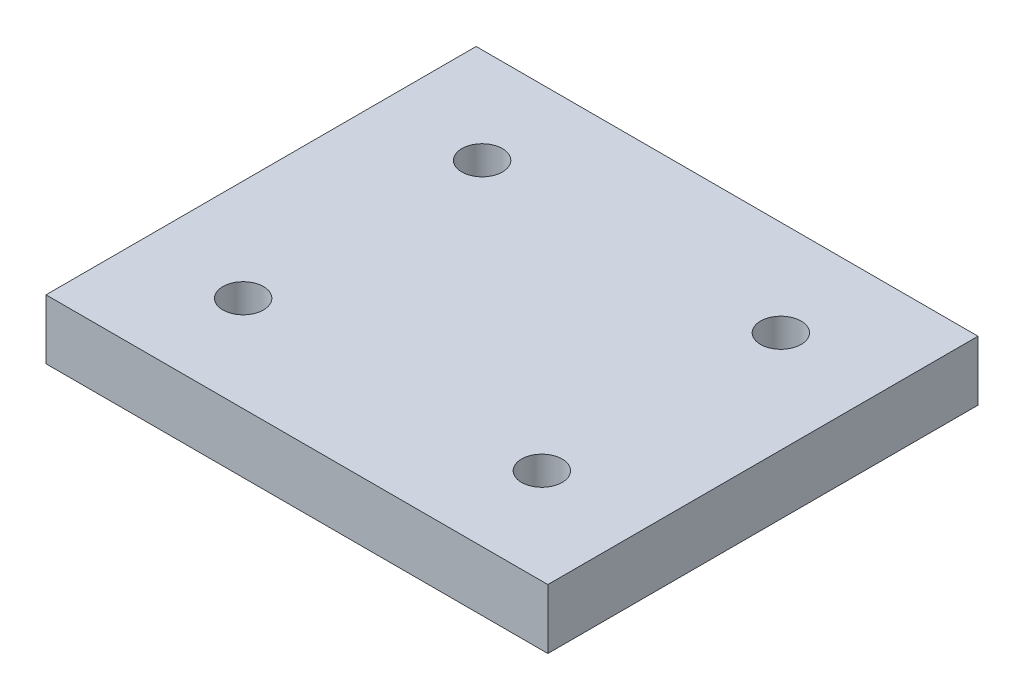
ISO-10303-21;
HEADER;
FILE_DESCRIPTION(('STEP AP214'),'2;1');
FILE_NAME('part.step','',(''),(''),'','','');
FILE_SCHEMA(('AUTOMOTIVE_DESIGN { 1 0 10303 214 1 1 1 1 }'));
ENDSEC;
DATA;
#1=APPLICATION_CONTEXT('core data for automotive mechanical design processes');
#2=APPLICATION_PROTOCOL_DEFINITION('international standard','automotive_design',2000,#1);
#3=PRODUCT_CONTEXT('',#1,'mechanical');
#4=PRODUCT('Part','Part','',(#3));
#5=PRODUCT_RELATED_PRODUCT_CATEGORY('part','',(#4));
#6=PRODUCT_DEFINITION_FORMATION('','',#4);
#7=PRODUCT_DEFINITION_CONTEXT('part definition',#1,'design');
#8=PRODUCT_DEFINITION('design','',#6,#7);
#9=PRODUCT_DEFINITION_SHAPE('','',#8);
#10=(LENGTH_UNIT() NAMED_UNIT(*) SI_UNIT(.MILLI.,.METRE.));
#11=(NAMED_UNIT(*) PLANE_ANGLE_UNIT() SI_UNIT($,.RADIAN.));
#12=(NAMED_UNIT(*) SI_UNIT($,.STERADIAN.) SOLID_ANGLE_UNIT());
#13=UNCERTAINTY_MEASURE_WITH_UNIT(LENGTH_MEASURE(1.E-05),#10,'distance_accuracy_value','');
#14=(GEOMETRIC_REPRESENTATION_CONTEXT(3) GLOBAL_UNCERTAINTY_ASSIGNED_CONTEXT((#13)) GLOBAL_UNIT_ASSIGNED_CONTEXT((#10,
#11,#12)) REPRESENTATION_CONTEXT('',''));
#15=CARTESIAN_POINT('',(0.,0.,0.));
#16=DIRECTION('',(0.,0.,1.));
#17=DIRECTION('',(1.,0.,0.));
#18=AXIS2_PLACEMENT_3D('',#15,#16,#17);
#19=CARTESIAN_POINT('',(0.,5.,0.));
#20=DIRECTION('',(1.,0.,0.));
#21=DIRECTION('',(0.,0.,-1.));
#22=AXIS2_PLACEMENT_3D('',#19,#20,#21);
#23=PLANE('',#22);
#24=DIRECTION('',(0.,0.,1.));
#25=VECTOR('',#24,1.);
#26=CARTESIAN_POINT('',(0.,0.,0.));
#27=LINE('',#26,#25);
#28=CARTESIAN_POINT('',(0.,0.,-36.));
#29=VERTEX_POINT('',#28);
#30=CARTESIAN_POINT('',(0.,0.,0.));
#31=VERTEX_POINT('',#30);
#32=EDGE_CURVE('E98',#29,#31,#27,.T.);
#33=ORIENTED_EDGE('',*,*,#32,.T.);
#34=DIRECTION('',(0.,-1.,0.));
#35=VECTOR('',#34,1.);
#36=CARTESIAN_POINT('',(0.,5.,0.));
#37=LINE('',#36,#35);
#38=CARTESIAN_POINT('',(0.,5.,0.));
#39=VERTEX_POINT('',#38);
#40=EDGE_CURVE('E11',#39,#31,#37,.T.);
#41=ORIENTED_EDGE('',*,*,#40,.F.);
#42=DIRECTION('',(0.,0.,1.));
#43=VECTOR('',#42,1.);
#44=CARTESIAN_POINT('',(0.,5.,0.));
#45=LINE('',#44,#43);
#46=CARTESIAN_POINT('',(0.,5.,-36.));
#47=VERTEX_POINT('',#46);
#48=EDGE_CURVE('E86',#47,#39,#45,.T.);
#49=ORIENTED_EDGE('',*,*,#48,.F.);
#50=DIRECTION('',(0.,-1.,0.));
#51=VECTOR('',#50,1.);
#52=CARTESIAN_POINT('',(0.,5.,-36.));
#53=LINE('',#52,#51);
#54=EDGE_CURVE('E94',#47,#29,#53,.T.);
#55=ORIENTED_EDGE('',*,*,#54,.T.);
#56=EDGE_LOOP('',(#33,#41,#49,#55));
#57=FACE_BOUND('',#56,.T.);
#58=ADVANCED_FACE('F35',(#57),#23,.F.);
#59=CARTESIAN_POINT('',(0.,5.,0.));
#60=DIRECTION('',(0.,0.,-1.));
#61=DIRECTION('',(-1.,0.,0.));
#62=AXIS2_PLACEMENT_3D('',#59,#60,#61);
#63=PLANE('',#62);
#64=DIRECTION('',(1.,0.,0.));
#65=VECTOR('',#64,1.);
#66=CARTESIAN_POINT('',(0.,0.,0.));
#67=LINE('',#66,#65);
#68=CARTESIAN_POINT('',(42.,0.,0.));
#69=VERTEX_POINT('',#68);
#70=EDGE_CURVE('E90',#31,#69,#67,.T.);
#71=ORIENTED_EDGE('',*,*,#70,.T.);
#72=DIRECTION('',(0.,-1.,0.));
#73=VECTOR('',#72,1.);
#74=CARTESIAN_POINT('',(42.,5.,0.));
#75=LINE('',#74,#73);
#76=CARTESIAN_POINT('',(42.,5.,0.));
#77=VERTEX_POINT('',#76);
#78=EDGE_CURVE('E43',#77,#69,#75,.T.);
#79=ORIENTED_EDGE('',*,*,#78,.F.);
#80=DIRECTION('',(1.,0.,0.));
#81=VECTOR('',#80,1.);
#82=CARTESIAN_POINT('',(0.,5.,0.));
#83=LINE('',#82,#81);
#84=EDGE_CURVE('E81',#39,#77,#83,.T.);
#85=ORIENTED_EDGE('',*,*,#84,.F.);
#86=ORIENTED_EDGE('',*,*,#40,.T.);
#87=EDGE_LOOP('',(#71,#79,#85,#86));
#88=FACE_BOUND('',#87,.T.);
#89=ADVANCED_FACE('F89',(#88),#63,.F.);
#90=CARTESIAN_POINT('',(42.,5.,0.));
#91=DIRECTION('',(-1.,0.,0.));
#92=DIRECTION('',(0.,0.,1.));
#93=AXIS2_PLACEMENT_3D('',#90,#91,#92);
#94=PLANE('',#93);
#95=DIRECTION('',(0.,0.,-1.));
#96=VECTOR('',#95,1.);
#97=CARTESIAN_POINT('',(42.,0.,0.));
#98=LINE('',#97,#96);
#99=CARTESIAN_POINT('',(42.,0.,-36.));
#100=VERTEX_POINT('',#99);
#101=EDGE_CURVE('E68',#69,#100,#98,.T.);
#102=ORIENTED_EDGE('',*,*,#101,.T.);
#103=DIRECTION('',(0.,-1.,0.));
#104=VECTOR('',#103,1.);
#105=CARTESIAN_POINT('',(42.,5.,-36.));
#106=LINE('',#105,#104);
#107=CARTESIAN_POINT('',(42.,5.,-36.));
#108=VERTEX_POINT('',#107);
#109=EDGE_CURVE('E91',#108,#100,#106,.T.);
#110=ORIENTED_EDGE('',*,*,#109,.F.);
#111=DIRECTION('',(0.,0.,-1.));
#112=VECTOR('',#111,1.);
#113=CARTESIAN_POINT('',(42.,5.,0.));
#114=LINE('',#113,#112);
#115=EDGE_CURVE('E84',#77,#108,#114,.T.);
#116=ORIENTED_EDGE('',*,*,#115,.F.);
#117=ORIENTED_EDGE('',*,*,#78,.T.);
#118=EDGE_LOOP('',(#102,#110,#116,#117));
#119=FACE_BOUND('',#118,.T.);
#120=ADVANCED_FACE('F92',(#119),#94,.F.);
#121=CARTESIAN_POINT('',(0.,5.,-36.));
#122=DIRECTION('',(0.,0.,1.));
#123=DIRECTION('',(1.,0.,0.));
#124=AXIS2_PLACEMENT_3D('',#121,#122,#123);
#125=PLANE('',#124);
#126=DIRECTION('',(-1.,0.,0.));
#127=VECTOR('',#126,1.);
#128=CARTESIAN_POINT('',(0.,0.,-36.));
#129=LINE('',#128,#127);
#130=EDGE_CURVE('E74',#100,#29,#129,.T.);
#131=ORIENTED_EDGE('',*,*,#130,.T.);
#132=ORIENTED_EDGE('',*,*,#54,.F.);
#133=DIRECTION('',(-1.,0.,0.));
#134=VECTOR('',#133,1.);
#135=CARTESIAN_POINT('',(0.,5.,-36.));
#136=LINE('',#135,#134);
#137=EDGE_CURVE('E51',#108,#47,#136,.T.);
#138=ORIENTED_EDGE('',*,*,#137,.F.);
#139=ORIENTED_EDGE('',*,*,#109,.T.);
#140=EDGE_LOOP('',(#131,#132,#138,#139));
#141=FACE_BOUND('',#140,.T.);
#142=ADVANCED_FACE('F106',(#141),#125,.F.);
#143=CARTESIAN_POINT('',(0.,5.,0.));
#144=DIRECTION('',(0.,-1.,0.));
#145=DIRECTION('',(0.,0.,-1.));
#146=AXIS2_PLACEMENT_3D('',#143,#144,#145);
#147=PLANE('',#146);
#148=CARTESIAN_POINT('',(8.5,5.,-28.));
#149=DIRECTION('',(0.,1.,0.));
#150=DIRECTION('',(0.,0.,1.));
#151=AXIS2_PLACEMENT_3D('',#148,#149,#150);
#152=CIRCLE('',#151,1.7);
#153=CARTESIAN_POINT('',(8.5,5.,-26.3));
#154=VERTEX_POINT('',#153);
#155=EDGE_CURVE('E130',#154,#154,#152,.T.);
#156=ORIENTED_EDGE('',*,*,#155,.F.);
#157=EDGE_LOOP('',(#156));
#158=FACE_BOUND('',#157,.T.);
#159=CARTESIAN_POINT('',(8.5,5.,-8.));
#160=DIRECTION('',(0.,1.,0.));
#161=DIRECTION('',(0.,0.,1.));
#162=AXIS2_PLACEMENT_3D('',#159,#160,#161);
#163=CIRCLE('',#162,1.7);
#164=CARTESIAN_POINT('',(8.5,5.,-6.3));
#165=VERTEX_POINT('',#164);
#166=EDGE_CURVE('E124',#165,#165,#163,.T.);
#167=ORIENTED_EDGE('',*,*,#166,.F.);
#168=EDGE_LOOP('',(#167));
#169=FACE_BOUND('',#168,.T.);
#170=CARTESIAN_POINT('',(33.5,5.,-8.));
#171=DIRECTION('',(0.,1.,0.));
#172=DIRECTION('',(0.,0.,1.));
#173=AXIS2_PLACEMENT_3D('',#170,#171,#172);
#174=CIRCLE('',#173,1.7);
#175=CARTESIAN_POINT('',(33.5,5.,-6.3));
#176=VERTEX_POINT('',#175);
#177=EDGE_CURVE('E118',#176,#176,#174,.T.);
#178=ORIENTED_EDGE('',*,*,#177,.F.);
#179=EDGE_LOOP('',(#178));
#180=FACE_BOUND('',#179,.T.);
#181=CARTESIAN_POINT('',(33.5,5.,-28.));
#182=DIRECTION('',(0.,1.,0.));
#183=DIRECTION('',(0.,0.,1.));
#184=AXIS2_PLACEMENT_3D('',#181,#182,#183);
#185=CIRCLE('',#184,1.7);
#186=CARTESIAN_POINT('',(33.5,5.,-26.3));
#187=VERTEX_POINT('',#186);
#188=EDGE_CURVE('E112',#187,#187,#185,.T.);
#189=ORIENTED_EDGE('',*,*,#188,.F.);
#190=EDGE_LOOP('',(#189));
#191=FACE_BOUND('',#190,.T.);
#192=ORIENTED_EDGE('',*,*,#48,.T.);
#193=ORIENTED_EDGE('',*,*,#84,.T.);
#194=ORIENTED_EDGE('',*,*,#115,.T.);
#195=ORIENTED_EDGE('',*,*,#137,.T.);
#196=EDGE_LOOP('',(#192,#193,#194,#195));
#197=FACE_BOUND('',#196,.T.);
#198=ADVANCED_FACE('F82',(#158,#169,#180,#191,#197),#147,.F.);
#199=CARTESIAN_POINT('',(0.,0.,0.));
#200=DIRECTION('',(0.,-1.,0.));
#201=DIRECTION('',(0.,0.,-1.));
#202=AXIS2_PLACEMENT_3D('',#199,#200,#201);
#203=PLANE('',#202);
#204=CARTESIAN_POINT('',(8.5,0.,-28.));
#205=DIRECTION('',(0.,1.,0.));
#206=DIRECTION('',(0.,0.,1.));
#207=AXIS2_PLACEMENT_3D('',#204,#205,#206);
#208=CIRCLE('',#207,1.7);
#209=CARTESIAN_POINT('',(8.5,0.,-26.3));
#210=VERTEX_POINT('',#209);
#211=EDGE_CURVE('E127',#210,#210,#208,.T.);
#212=ORIENTED_EDGE('',*,*,#211,.T.);
#213=EDGE_LOOP('',(#212));
#214=FACE_BOUND('',#213,.T.);
#215=CARTESIAN_POINT('',(8.5,0.,-8.));
#216=DIRECTION('',(0.,1.,0.));
#217=DIRECTION('',(0.,0.,1.));
#218=AXIS2_PLACEMENT_3D('',#215,#216,#217);
#219=CIRCLE('',#218,1.7);
#220=CARTESIAN_POINT('',(8.5,0.,-6.3));
#221=VERTEX_POINT('',#220);
#222=EDGE_CURVE('E121',#221,#221,#219,.T.);
#223=ORIENTED_EDGE('',*,*,#222,.T.);
#224=EDGE_LOOP('',(#223));
#225=FACE_BOUND('',#224,.T.);
#226=CARTESIAN_POINT('',(33.5,0.,-8.));
#227=DIRECTION('',(0.,1.,0.));
#228=DIRECTION('',(0.,0.,1.));
#229=AXIS2_PLACEMENT_3D('',#226,#227,#228);
#230=CIRCLE('',#229,1.7);
#231=CARTESIAN_POINT('',(33.5,0.,-6.3));
#232=VERTEX_POINT('',#231);
#233=EDGE_CURVE('E115',#232,#232,#230,.T.);
#234=ORIENTED_EDGE('',*,*,#233,.T.);
#235=EDGE_LOOP('',(#234));
#236=FACE_BOUND('',#235,.T.);
#237=CARTESIAN_POINT('',(33.5,0.,-28.));
#238=DIRECTION('',(0.,1.,0.));
#239=DIRECTION('',(0.,0.,1.));
#240=AXIS2_PLACEMENT_3D('',#237,#238,#239);
#241=CIRCLE('',#240,1.7);
#242=CARTESIAN_POINT('',(33.5,0.,-26.3));
#243=VERTEX_POINT('',#242);
#244=EDGE_CURVE('E101',#243,#243,#241,.T.);
#245=ORIENTED_EDGE('',*,*,#244,.T.);
#246=EDGE_LOOP('',(#245));
#247=FACE_BOUND('',#246,.T.);
#248=ORIENTED_EDGE('',*,*,#32,.F.);
#249=ORIENTED_EDGE('',*,*,#130,.F.);
#250=ORIENTED_EDGE('',*,*,#101,.F.);
#251=ORIENTED_EDGE('',*,*,#70,.F.);
#252=EDGE_LOOP('',(#248,#249,#250,#251));
#253=FACE_BOUND('',#252,.T.);
#254=ADVANCED_FACE('F109',(#214,#225,#236,#247,#253),#203,.T.);
#255=CARTESIAN_POINT('',(33.5,0.,-28.));
#256=DIRECTION('',(0.,1.,0.));
#257=DIRECTION('',(0.,0.,1.));
#258=AXIS2_PLACEMENT_3D('',#255,#256,#257);
#259=CYLINDRICAL_SURFACE('',#258,1.7);
#260=ORIENTED_EDGE('',*,*,#244,.F.);
#261=EDGE_LOOP('',(#260));
#262=FACE_BOUND('',#261,.T.);
#263=ORIENTED_EDGE('',*,*,#188,.T.);
#264=EDGE_LOOP('',(#263));
#265=FACE_BOUND('',#264,.T.);
#266=ADVANCED_FACE('F154',(#262,#265),#259,.F.);
#267=CARTESIAN_POINT('',(33.5,0.,-8.));
#268=DIRECTION('',(0.,1.,0.));
#269=DIRECTION('',(0.,0.,1.));
#270=AXIS2_PLACEMENT_3D('',#267,#268,#269);
#271=CYLINDRICAL_SURFACE('',#270,1.7);
#272=ORIENTED_EDGE('',*,*,#233,.F.);
#273=EDGE_LOOP('',(#272));
#274=FACE_BOUND('',#273,.T.);
#275=ORIENTED_EDGE('',*,*,#177,.T.);
#276=EDGE_LOOP('',(#275));
#277=FACE_BOUND('',#276,.T.);
#278=ADVANCED_FACE('F156',(#274,#277),#271,.F.);
#279=CARTESIAN_POINT('',(8.5,0.,-8.));
#280=DIRECTION('',(0.,1.,0.));
#281=DIRECTION('',(0.,0.,1.));
#282=AXIS2_PLACEMENT_3D('',#279,#280,#281);
#283=CYLINDRICAL_SURFACE('',#282,1.7);
#284=ORIENTED_EDGE('',*,*,#222,.F.);
#285=EDGE_LOOP('',(#284));
#286=FACE_BOUND('',#285,.T.);
#287=ORIENTED_EDGE('',*,*,#166,.T.);
#288=EDGE_LOOP('',(#287));
#289=FACE_BOUND('',#288,.T.);
#290=ADVANCED_FACE('F141',(#286,#289),#283,.F.);
#291=CARTESIAN_POINT('',(8.5,0.,-28.));
#292=DIRECTION('',(0.,1.,0.));
#293=DIRECTION('',(0.,0.,1.));
#294=AXIS2_PLACEMENT_3D('',#291,#292,#293);
#295=CYLINDRICAL_SURFACE('',#294,1.7);
#296=ORIENTED_EDGE('',*,*,#211,.F.);
#297=EDGE_LOOP('',(#296));
#298=FACE_BOUND('',#297,.T.);
#299=ORIENTED_EDGE('',*,*,#155,.T.);
#300=EDGE_LOOP('',(#299));
#301=FACE_BOUND('',#300,.T.);
#302=ADVANCED_FACE('F138',(#298,#301),#295,.F.);
#303=CLOSED_SHELL('',(#58,#89,#120,#142,#198,#254,#266,#278,#290,#302));
#304=MANIFOLD_SOLID_BREP('B2',#303);
#305=ADVANCED_BREP_SHAPE_REPRESENTATION('',(#18,#304),#14);
#306=SHAPE_DEFINITION_REPRESENTATION(#9,#305);
ENDSEC;
END-ISO-10303-21;
